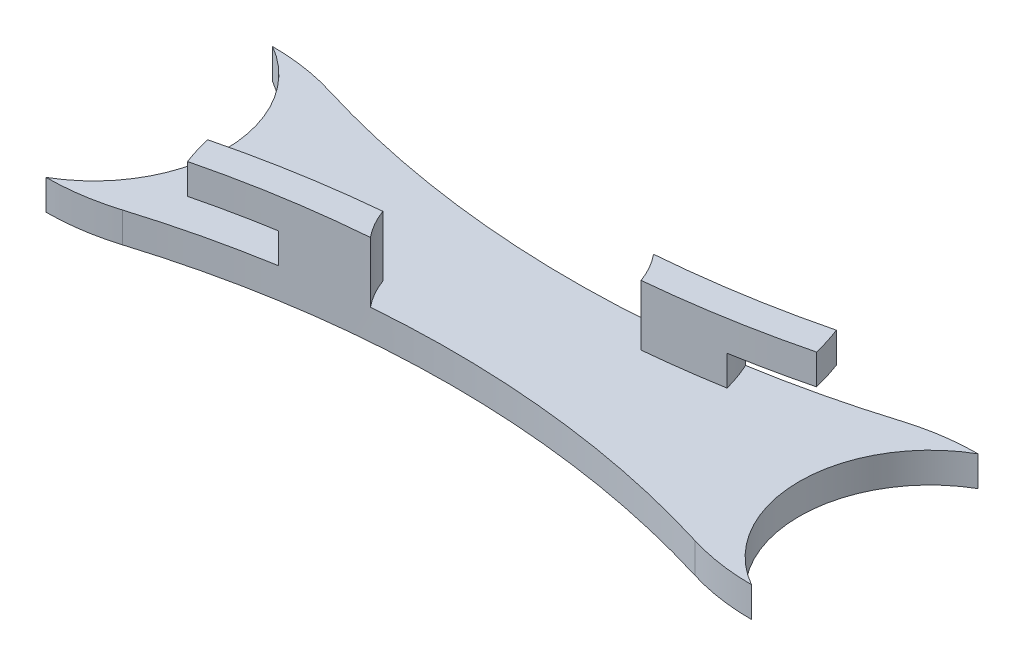
ISO-10303-21;
HEADER;
FILE_DESCRIPTION(('STEP AP214'),'2;1');
FILE_NAME('part.step','',(''),(''),'','','');
FILE_SCHEMA(('AUTOMOTIVE_DESIGN { 1 0 10303 214 1 1 1 1 }'));
ENDSEC;
DATA;
#1=APPLICATION_CONTEXT('core data for automotive mechanical design processes');
#2=APPLICATION_PROTOCOL_DEFINITION('international standard','automotive_design',2000,#1);
#3=PRODUCT_CONTEXT('',#1,'mechanical');
#4=PRODUCT('Part','Part','',(#3));
#5=PRODUCT_RELATED_PRODUCT_CATEGORY('part','',(#4));
#6=PRODUCT_DEFINITION_FORMATION('','',#4);
#7=PRODUCT_DEFINITION_CONTEXT('part definition',#1,'design');
#8=PRODUCT_DEFINITION('design','',#6,#7);
#9=PRODUCT_DEFINITION_SHAPE('','',#8);
#10=(LENGTH_UNIT() NAMED_UNIT(*) SI_UNIT(.MILLI.,.METRE.));
#11=(NAMED_UNIT(*) PLANE_ANGLE_UNIT() SI_UNIT($,.RADIAN.));
#12=(NAMED_UNIT(*) SI_UNIT($,.STERADIAN.) SOLID_ANGLE_UNIT());
#13=UNCERTAINTY_MEASURE_WITH_UNIT(LENGTH_MEASURE(1.E-05),#10,'distance_accuracy_value','');
#14=(GEOMETRIC_REPRESENTATION_CONTEXT(3) GLOBAL_UNCERTAINTY_ASSIGNED_CONTEXT((#13)) GLOBAL_UNIT_ASSIGNED_CONTEXT((#10,
#11,#12)) REPRESENTATION_CONTEXT('',''));
#15=CARTESIAN_POINT('',(0.,0.,0.));
#16=DIRECTION('',(0.,0.,1.));
#17=DIRECTION('',(1.,0.,0.));
#18=AXIS2_PLACEMENT_3D('',#15,#16,#17);
#19=CARTESIAN_POINT('',(0.,3.,0.));
#20=DIRECTION('',(0.,1.,0.));
#21=DIRECTION('',(0.,0.,1.));
#22=AXIS2_PLACEMENT_3D('',#19,#20,#21);
#23=PLANE('',#22);
#24=CARTESIAN_POINT('',(-18.3907804623369,3.,22.3216384207448));
#25=DIRECTION('',(0.,1.,0.));
#26=DIRECTION('',(0.,0.,1.));
#27=AXIS2_PLACEMENT_3D('',#24,#25,#26);
#28=CIRCLE('',#27,99.9074307873152);
#29=CARTESIAN_POINT('',(-27.7796908463692,3.,-77.143647424734));
#30=VERTEX_POINT('',#29);
#31=CARTESIAN_POINT('',(-35.3170488189357,3.,-76.141533202165));
#32=VERTEX_POINT('',#31);
#33=EDGE_CURVE('E63',#30,#32,#28,.T.);
#34=ORIENTED_EDGE('',*,*,#33,.F.);
#35=CARTESIAN_POINT('',(-18.3907804623369,3.,-80.5857923665705));
#36=DIRECTION('',(0.,1.,0.));
#37=DIRECTION('',(0.,0.,1.));
#38=AXIS2_PLACEMENT_3D('',#35,#36,#37);
#39=CIRCLE('',#38,10.);
#40=CARTESIAN_POINT('',(-26.1478285794307,3.,-74.2748332865976));
#41=VERTEX_POINT('',#40);
#42=EDGE_CURVE('E273',#30,#41,#39,.T.);
#43=ORIENTED_EDGE('',*,*,#42,.T.);
#44=CARTESIAN_POINT('',(-18.3907804623369,3.,22.3216384207448));
#45=DIRECTION('',(0.,1.,0.));
#46=DIRECTION('',(0.,0.,1.));
#47=AXIS2_PLACEMENT_3D('',#44,#45,#46);
#48=CIRCLE('',#47,96.9074307873152);
#49=CARTESIAN_POINT('',(10.0483327179945,3.,-70.3188871785554));
#50=VERTEX_POINT('',#49);
#51=EDGE_CURVE('E192',#50,#41,#48,.T.);
#52=ORIENTED_EDGE('',*,*,#51,.F.);
#53=CARTESIAN_POINT('',(16.6562249214557,3.,-91.8441226157684));
#54=DIRECTION('',(0.,1.,0.));
#55=DIRECTION('',(0.,0.,1.));
#56=AXIS2_PLACEMENT_3D('',#53,#54,#55);
#57=CIRCLE('',#56,22.5166604983957);
#58=CARTESIAN_POINT('',(16.6562249214557,3.,-69.3274621173727));
#59=VERTEX_POINT('',#58);
#60=EDGE_CURVE('E330',#50,#59,#57,.T.);
#61=ORIENTED_EDGE('',*,*,#60,.T.);
#62=CARTESIAN_POINT('',(23.1562249214557,3.,-80.5857923665705));
#63=DIRECTION('',(0.,1.,0.));
#64=DIRECTION('',(0.,0.,1.));
#65=AXIS2_PLACEMENT_3D('',#62,#63,#64);
#66=CIRCLE('',#65,13.0000000000002);
#67=CARTESIAN_POINT('',(16.6562249214557,3.,-91.8441226157684));
#68=VERTEX_POINT('',#67);
#69=EDGE_CURVE('E333',#68,#59,#66,.T.);
#70=ORIENTED_EDGE('',*,*,#69,.F.);
#71=CARTESIAN_POINT('',(16.6562249214557,3.,-69.3274621173726));
#72=DIRECTION('',(0.,1.,0.));
#73=DIRECTION('',(0.,0.,1.));
#74=AXIS2_PLACEMENT_3D('',#71,#72,#73);
#75=CIRCLE('',#74,22.5166604983957);
#76=CARTESIAN_POINT('',(10.0483327179944,3.,-90.8526975545857));
#77=VERTEX_POINT('',#76);
#78=EDGE_CURVE('E337',#68,#77,#75,.T.);
#79=ORIENTED_EDGE('',*,*,#78,.T.);
#80=CARTESIAN_POINT('',(-18.3907804623369,3.,-183.493223153886));
#81=DIRECTION('',(0.,1.,0.));
#82=DIRECTION('',(0.,0.,1.));
#83=AXIS2_PLACEMENT_3D('',#80,#81,#82);
#84=CIRCLE('',#83,96.9074307873153);
#85=CARTESIAN_POINT('',(-2.49207111624066,3.,-87.8988656691125));
#86=VERTEX_POINT('',#85);
#87=EDGE_CURVE('E341',#86,#77,#84,.T.);
#88=ORIENTED_EDGE('',*,*,#87,.F.);
#89=CARTESIAN_POINT('',(-18.3907804623369,3.,-80.5857923665705));
#90=DIRECTION('',(0.,1.,0.));
#91=DIRECTION('',(0.,0.,1.));
#92=AXIS2_PLACEMENT_3D('',#89,#90,#91);
#93=CIRCLE('',#92,17.5);
#94=CARTESIAN_POINT('',(-1.46451210573816,3.,-85.0300515309761));
#95=VERTEX_POINT('',#94);
#96=EDGE_CURVE('E297',#95,#86,#93,.T.);
#97=ORIENTED_EDGE('',*,*,#96,.F.);
#98=CARTESIAN_POINT('',(-18.3907804623369,3.,-183.493223153886));
#99=DIRECTION('',(0.,1.,0.));
#100=DIRECTION('',(0.,0.,1.));
#101=AXIS2_PLACEMENT_3D('',#98,#99,#100);
#102=CIRCLE('',#101,99.9074307873152);
#103=CARTESIAN_POINT('',(-9.00187007830468,3.,-84.0279373084071));
#104=VERTEX_POINT('',#103);
#105=EDGE_CURVE('E70',#104,#95,#102,.T.);
#106=ORIENTED_EDGE('',*,*,#105,.F.);
#107=CARTESIAN_POINT('',(-18.3907804623369,3.,-80.5857923665705));
#108=DIRECTION('',(0.,1.,0.));
#109=DIRECTION('',(0.,0.,1.));
#110=AXIS2_PLACEMENT_3D('',#107,#108,#109);
#111=CIRCLE('',#110,10.);
#112=CARTESIAN_POINT('',(-10.6337323452432,3.,-86.8967514465435));
#113=VERTEX_POINT('',#112);
#114=EDGE_CURVE('E237',#104,#113,#111,.T.);
#115=ORIENTED_EDGE('',*,*,#114,.T.);
#116=CARTESIAN_POINT('',(-46.8298936426683,3.,-90.8526975545857));
#117=VERTEX_POINT('',#116);
#118=EDGE_CURVE('E342',#117,#113,#84,.T.);
#119=ORIENTED_EDGE('',*,*,#118,.F.);
#120=CARTESIAN_POINT('',(-53.4377858461296,3.,-69.3274621173728));
#121=DIRECTION('',(0.,1.,0.));
#122=DIRECTION('',(0.,0.,1.));
#123=AXIS2_PLACEMENT_3D('',#120,#121,#122);
#124=CIRCLE('',#123,22.5166604983956);
#125=CARTESIAN_POINT('',(-53.4377858461296,3.,-91.8441226157684));
#126=VERTEX_POINT('',#125);
#127=EDGE_CURVE('E346',#117,#126,#124,.T.);
#128=ORIENTED_EDGE('',*,*,#127,.T.);
#129=CARTESIAN_POINT('',(-59.9377858461296,3.,-80.5857923665705));
#130=DIRECTION('',(0.,1.,0.));
#131=DIRECTION('',(0.,0.,1.));
#132=AXIS2_PLACEMENT_3D('',#129,#130,#131);
#133=CIRCLE('',#132,13.0000000000001);
#134=CARTESIAN_POINT('',(-53.4377858461296,3.,-69.3274621173728));
#135=VERTEX_POINT('',#134);
#136=EDGE_CURVE('E318',#135,#126,#133,.T.);
#137=ORIENTED_EDGE('',*,*,#136,.F.);
#138=CARTESIAN_POINT('',(-53.4377858461296,3.,-91.8441226157683));
#139=DIRECTION('',(0.,1.,0.));
#140=DIRECTION('',(0.,0.,1.));
#141=AXIS2_PLACEMENT_3D('',#138,#139,#140);
#142=CIRCLE('',#141,22.5166604983955);
#143=CARTESIAN_POINT('',(-46.8298936426682,3.,-70.3188871785554));
#144=VERTEX_POINT('',#143);
#145=EDGE_CURVE('E322',#135,#144,#142,.T.);
#146=ORIENTED_EDGE('',*,*,#145,.T.);
#147=CARTESIAN_POINT('',(-34.2894898084332,3.,-73.2727190640286));
#148=VERTEX_POINT('',#147);
#149=EDGE_CURVE('E327',#148,#144,#48,.T.);
#150=ORIENTED_EDGE('',*,*,#149,.F.);
#151=CARTESIAN_POINT('',(-18.3907804623369,3.,-80.5857923665705));
#152=DIRECTION('',(0.,1.,0.));
#153=DIRECTION('',(0.,0.,1.));
#154=AXIS2_PLACEMENT_3D('',#151,#152,#153);
#155=CIRCLE('',#154,17.5);
#156=EDGE_CURVE('E272',#32,#148,#155,.T.);
#157=ORIENTED_EDGE('',*,*,#156,.F.);
#158=EDGE_LOOP('',(#34,#43,#52,#61,#70,#79,#88,#97,#106,#115,#119,#128,#137,#146,#150,#157));
#159=FACE_BOUND('',#158,.T.);
#160=ADVANCED_FACE('F47',(#159),#23,.T.);
#161=CARTESIAN_POINT('',(-59.9377858461296,3.,-80.5857923665705));
#162=DIRECTION('',(0.,-1.,0.));
#163=DIRECTION('',(0.,0.,-1.));
#164=AXIS2_PLACEMENT_3D('',#161,#162,#163);
#165=CYLINDRICAL_SURFACE('',#164,13.0000000000001);
#166=CARTESIAN_POINT('',(-59.9377858461296,0.,-80.5857923665705));
#167=DIRECTION('',(0.,1.,0.));
#168=DIRECTION('',(0.,0.,1.));
#169=AXIS2_PLACEMENT_3D('',#166,#167,#168);
#170=CIRCLE('',#169,13.0000000000001);
#171=CARTESIAN_POINT('',(-53.4377858461296,0.,-69.3274621173728));
#172=VERTEX_POINT('',#171);
#173=CARTESIAN_POINT('',(-53.4377858461296,0.,-91.8441226157684));
#174=VERTEX_POINT('',#173);
#175=EDGE_CURVE('E291',#172,#174,#170,.T.);
#176=ORIENTED_EDGE('',*,*,#175,.F.);
#177=DIRECTION('',(0.,-1.,0.));
#178=VECTOR('',#177,1.);
#179=CARTESIAN_POINT('',(-53.4377858461296,3.,-69.3274621173728));
#180=LINE('',#179,#178);
#181=EDGE_CURVE('E11',#135,#172,#180,.T.);
#182=ORIENTED_EDGE('',*,*,#181,.F.);
#183=ORIENTED_EDGE('',*,*,#136,.T.);
#184=DIRECTION('',(0.,-1.,0.));
#185=VECTOR('',#184,1.);
#186=CARTESIAN_POINT('',(-53.4377858461296,3.,-91.8441226157684));
#187=LINE('',#186,#185);
#188=EDGE_CURVE('E349',#126,#174,#187,.T.);
#189=ORIENTED_EDGE('',*,*,#188,.T.);
#190=EDGE_LOOP('',(#176,#182,#183,#189));
#191=FACE_BOUND('',#190,.T.);
#192=ADVANCED_FACE('F49',(#191),#165,.F.);
#193=CARTESIAN_POINT('',(-53.4377858461296,3.,-91.8441226157683));
#194=DIRECTION('',(0.,-1.,0.));
#195=DIRECTION('',(0.,0.,-1.));
#196=AXIS2_PLACEMENT_3D('',#193,#194,#195);
#197=CYLINDRICAL_SURFACE('',#196,22.5166604983955);
#198=CARTESIAN_POINT('',(-53.4377858461296,0.,-91.8441226157683));
#199=DIRECTION('',(0.,1.,0.));
#200=DIRECTION('',(0.,0.,1.));
#201=AXIS2_PLACEMENT_3D('',#198,#199,#200);
#202=CIRCLE('',#201,22.5166604983955);
#203=CARTESIAN_POINT('',(-46.8298936426682,0.,-70.3188871785554));
#204=VERTEX_POINT('',#203);
#205=EDGE_CURVE('E353',#172,#204,#202,.T.);
#206=ORIENTED_EDGE('',*,*,#205,.T.);
#207=DIRECTION('',(0.,-1.,0.));
#208=VECTOR('',#207,1.);
#209=CARTESIAN_POINT('',(-46.8298936426682,3.,-70.3188871785554));
#210=LINE('',#209,#208);
#211=EDGE_CURVE('E56',#144,#204,#210,.T.);
#212=ORIENTED_EDGE('',*,*,#211,.F.);
#213=ORIENTED_EDGE('',*,*,#145,.F.);
#214=ORIENTED_EDGE('',*,*,#181,.T.);
#215=EDGE_LOOP('',(#206,#212,#213,#214));
#216=FACE_BOUND('',#215,.T.);
#217=ADVANCED_FACE('F401',(#216),#197,.T.);
#218=CARTESIAN_POINT('',(-18.3907804623369,3.,22.3216384207448));
#219=DIRECTION('',(0.,-1.,0.));
#220=DIRECTION('',(0.,0.,-1.));
#221=AXIS2_PLACEMENT_3D('',#218,#219,#220);
#222=CYLINDRICAL_SURFACE('',#221,96.9074307873152);
#223=CARTESIAN_POINT('',(-18.3907804623369,0.,22.3216384207448));
#224=DIRECTION('',(0.,1.,0.));
#225=DIRECTION('',(0.,0.,1.));
#226=AXIS2_PLACEMENT_3D('',#223,#224,#225);
#227=CIRCLE('',#226,96.9074307873152);
#228=CARTESIAN_POINT('',(10.0483327179945,0.,-70.3188871785554));
#229=VERTEX_POINT('',#228);
#230=EDGE_CURVE('E357',#229,#204,#227,.T.);
#231=ORIENTED_EDGE('',*,*,#230,.F.);
#232=DIRECTION('',(0.,-1.,0.));
#233=VECTOR('',#232,1.);
#234=CARTESIAN_POINT('',(10.0483327179945,3.,-70.3188871785554));
#235=LINE('',#234,#233);
#236=EDGE_CURVE('E394',#50,#229,#235,.T.);
#237=ORIENTED_EDGE('',*,*,#236,.F.);
#238=ORIENTED_EDGE('',*,*,#51,.T.);
#239=DIRECTION('',(0.,-1.,0.));
#240=VECTOR('',#239,1.);
#241=CARTESIAN_POINT('',(-26.1478285794307,6.,-74.2748332865976));
#242=LINE('',#241,#240);
#243=CARTESIAN_POINT('',(-26.1478285794307,9.,-74.2748332865975));
#244=VERTEX_POINT('',#243);
#245=EDGE_CURVE('E184',#244,#41,#242,.T.);
#246=ORIENTED_EDGE('',*,*,#245,.F.);
#247=CARTESIAN_POINT('',(-18.3907804623369,9.,22.3216384207448));
#248=DIRECTION('',(0.,1.,0.));
#249=DIRECTION('',(0.,0.,1.));
#250=AXIS2_PLACEMENT_3D('',#247,#248,#249);
#251=CIRCLE('',#250,96.9074307873152);
#252=CARTESIAN_POINT('',(-41.7674479828455,9.,-71.7239970836947));
#253=VERTEX_POINT('',#252);
#254=EDGE_CURVE('E190',#244,#253,#251,.T.);
#255=ORIENTED_EDGE('',*,*,#254,.T.);
#256=DIRECTION('',(0.,-1.,0.));
#257=VECTOR('',#256,1.);
#258=CARTESIAN_POINT('',(-41.7674479828455,9.,-71.7239970836947));
#259=LINE('',#258,#257);
#260=CARTESIAN_POINT('',(-41.7674479828455,6.,-71.7239970836947));
#261=VERTEX_POINT('',#260);
#262=EDGE_CURVE('E224',#253,#261,#259,.T.);
#263=ORIENTED_EDGE('',*,*,#262,.T.);
#264=CARTESIAN_POINT('',(-18.3907804623369,6.,22.3216384207448));
#265=DIRECTION('',(0.,1.,0.));
#266=DIRECTION('',(0.,0.,1.));
#267=AXIS2_PLACEMENT_3D('',#264,#265,#266);
#268=CIRCLE('',#267,96.9074307873152);
#269=CARTESIAN_POINT('',(-34.2894898084332,6.,-73.2727190640285));
#270=VERTEX_POINT('',#269);
#271=EDGE_CURVE('E225',#270,#261,#268,.T.);
#272=ORIENTED_EDGE('',*,*,#271,.F.);
#273=DIRECTION('',(0.,-1.,0.));
#274=VECTOR('',#273,1.);
#275=CARTESIAN_POINT('',(-34.2894898084332,6.,-73.2727190640286));
#276=LINE('',#275,#274);
#277=EDGE_CURVE('E196',#270,#148,#276,.T.);
#278=ORIENTED_EDGE('',*,*,#277,.T.);
#279=ORIENTED_EDGE('',*,*,#149,.T.);
#280=ORIENTED_EDGE('',*,*,#211,.T.);
#281=EDGE_LOOP('',(#231,#237,#238,#246,#255,#263,#272,#278,#279,#280));
#282=FACE_BOUND('',#281,.T.);
#283=ADVANCED_FACE('F187',(#282),#222,.F.);
#284=CARTESIAN_POINT('',(16.6562249214557,3.,-91.8441226157684));
#285=DIRECTION('',(0.,-1.,0.));
#286=DIRECTION('',(0.,0.,-1.));
#287=AXIS2_PLACEMENT_3D('',#284,#285,#286);
#288=CYLINDRICAL_SURFACE('',#287,22.5166604983957);
#289=CARTESIAN_POINT('',(16.6562249214557,0.,-91.8441226157684));
#290=DIRECTION('',(0.,1.,0.));
#291=DIRECTION('',(0.,0.,1.));
#292=AXIS2_PLACEMENT_3D('',#289,#290,#291);
#293=CIRCLE('',#292,22.5166604983957);
#294=CARTESIAN_POINT('',(16.6562249214557,0.,-69.3274621173727));
#295=VERTEX_POINT('',#294);
#296=EDGE_CURVE('E361',#229,#295,#293,.T.);
#297=ORIENTED_EDGE('',*,*,#296,.T.);
#298=DIRECTION('',(0.,-1.,0.));
#299=VECTOR('',#298,1.);
#300=CARTESIAN_POINT('',(16.6562249214557,3.,-69.3274621173727));
#301=LINE('',#300,#299);
#302=EDGE_CURVE('E391',#59,#295,#301,.T.);
#303=ORIENTED_EDGE('',*,*,#302,.F.);
#304=ORIENTED_EDGE('',*,*,#60,.F.);
#305=ORIENTED_EDGE('',*,*,#236,.T.);
#306=EDGE_LOOP('',(#297,#303,#304,#305));
#307=FACE_BOUND('',#306,.T.);
#308=ADVANCED_FACE('F410',(#307),#288,.T.);
#309=CARTESIAN_POINT('',(23.1562249214557,3.,-80.5857923665705));
#310=DIRECTION('',(0.,-1.,0.));
#311=DIRECTION('',(0.,0.,-1.));
#312=AXIS2_PLACEMENT_3D('',#309,#310,#311);
#313=CYLINDRICAL_SURFACE('',#312,13.0000000000002);
#314=CARTESIAN_POINT('',(23.1562249214557,0.,-80.5857923665705));
#315=DIRECTION('',(0.,1.,0.));
#316=DIRECTION('',(0.,0.,1.));
#317=AXIS2_PLACEMENT_3D('',#314,#315,#316);
#318=CIRCLE('',#317,13.0000000000002);
#319=CARTESIAN_POINT('',(16.6562249214557,0.,-91.8441226157684));
#320=VERTEX_POINT('',#319);
#321=EDGE_CURVE('E365',#320,#295,#318,.T.);
#322=ORIENTED_EDGE('',*,*,#321,.F.);
#323=DIRECTION('',(0.,-1.,0.));
#324=VECTOR('',#323,1.);
#325=CARTESIAN_POINT('',(16.6562249214557,3.,-91.8441226157684));
#326=LINE('',#325,#324);
#327=EDGE_CURVE('E388',#68,#320,#326,.T.);
#328=ORIENTED_EDGE('',*,*,#327,.F.);
#329=ORIENTED_EDGE('',*,*,#69,.T.);
#330=ORIENTED_EDGE('',*,*,#302,.T.);
#331=EDGE_LOOP('',(#322,#328,#329,#330));
#332=FACE_BOUND('',#331,.T.);
#333=ADVANCED_FACE('F437',(#332),#313,.F.);
#334=CARTESIAN_POINT('',(16.6562249214557,3.,-69.3274621173726));
#335=DIRECTION('',(0.,-1.,0.));
#336=DIRECTION('',(0.,0.,-1.));
#337=AXIS2_PLACEMENT_3D('',#334,#335,#336);
#338=CYLINDRICAL_SURFACE('',#337,22.5166604983957);
#339=CARTESIAN_POINT('',(16.6562249214557,0.,-69.3274621173726));
#340=DIRECTION('',(0.,1.,0.));
#341=DIRECTION('',(0.,0.,1.));
#342=AXIS2_PLACEMENT_3D('',#339,#340,#341);
#343=CIRCLE('',#342,22.5166604983957);
#344=CARTESIAN_POINT('',(10.0483327179944,0.,-90.8526975545857));
#345=VERTEX_POINT('',#344);
#346=EDGE_CURVE('E369',#320,#345,#343,.T.);
#347=ORIENTED_EDGE('',*,*,#346,.T.);
#348=DIRECTION('',(0.,-1.,0.));
#349=VECTOR('',#348,1.);
#350=CARTESIAN_POINT('',(10.0483327179944,3.,-90.8526975545857));
#351=LINE('',#350,#349);
#352=EDGE_CURVE('E385',#77,#345,#351,.T.);
#353=ORIENTED_EDGE('',*,*,#352,.F.);
#354=ORIENTED_EDGE('',*,*,#78,.F.);
#355=ORIENTED_EDGE('',*,*,#327,.T.);
#356=EDGE_LOOP('',(#347,#353,#354,#355));
#357=FACE_BOUND('',#356,.T.);
#358=ADVANCED_FACE('F433',(#357),#338,.T.);
#359=CARTESIAN_POINT('',(-18.3907804623369,3.,-183.493223153886));
#360=DIRECTION('',(0.,-1.,0.));
#361=DIRECTION('',(0.,0.,-1.));
#362=AXIS2_PLACEMENT_3D('',#359,#360,#361);
#363=CYLINDRICAL_SURFACE('',#362,96.9074307873153);
#364=CARTESIAN_POINT('',(-18.3907804623369,0.,-183.493223153886));
#365=DIRECTION('',(0.,1.,0.));
#366=DIRECTION('',(0.,0.,1.));
#367=AXIS2_PLACEMENT_3D('',#364,#365,#366);
#368=CIRCLE('',#367,96.9074307873153);
#369=CARTESIAN_POINT('',(-46.8298936426683,0.,-90.8526975545857));
#370=VERTEX_POINT('',#369);
#371=EDGE_CURVE('E373',#370,#345,#368,.T.);
#372=ORIENTED_EDGE('',*,*,#371,.F.);
#373=DIRECTION('',(0.,-1.,0.));
#374=VECTOR('',#373,1.);
#375=CARTESIAN_POINT('',(-46.8298936426683,3.,-90.8526975545857));
#376=LINE('',#375,#374);
#377=EDGE_CURVE('E382',#117,#370,#376,.T.);
#378=ORIENTED_EDGE('',*,*,#377,.F.);
#379=ORIENTED_EDGE('',*,*,#118,.T.);
#380=DIRECTION('',(0.,-1.,0.));
#381=VECTOR('',#380,1.);
#382=CARTESIAN_POINT('',(-10.6337323452432,6.,-86.8967514465435));
#383=LINE('',#382,#381);
#384=CARTESIAN_POINT('',(-10.6337323452432,9.,-86.8967514465435));
#385=VERTEX_POINT('',#384);
#386=EDGE_CURVE('E296',#385,#113,#383,.T.);
#387=ORIENTED_EDGE('',*,*,#386,.F.);
#388=CARTESIAN_POINT('',(-18.3907804623369,9.,-183.493223153886));
#389=DIRECTION('',(0.,1.,0.));
#390=DIRECTION('',(0.,0.,1.));
#391=AXIS2_PLACEMENT_3D('',#388,#389,#390);
#392=CIRCLE('',#391,96.9074307873153);
#393=CARTESIAN_POINT('',(4.98588705817165,9.,-89.4475876494463));
#394=VERTEX_POINT('',#393);
#395=EDGE_CURVE('E238',#385,#394,#392,.T.);
#396=ORIENTED_EDGE('',*,*,#395,.T.);
#397=DIRECTION('',(0.,-1.,0.));
#398=VECTOR('',#397,1.);
#399=CARTESIAN_POINT('',(4.98588705817165,9.,-89.4475876494463));
#400=LINE('',#399,#398);
#401=CARTESIAN_POINT('',(4.98588705817165,6.,-89.4475876494463));
#402=VERTEX_POINT('',#401);
#403=EDGE_CURVE('E253',#394,#402,#400,.T.);
#404=ORIENTED_EDGE('',*,*,#403,.T.);
#405=CARTESIAN_POINT('',(-18.3907804623369,6.,-183.493223153886));
#406=DIRECTION('',(0.,1.,0.));
#407=DIRECTION('',(0.,0.,1.));
#408=AXIS2_PLACEMENT_3D('',#405,#406,#407);
#409=CIRCLE('',#408,96.9074307873153);
#410=CARTESIAN_POINT('',(-2.49207111624066,6.,-87.8988656691124));
#411=VERTEX_POINT('',#410);
#412=EDGE_CURVE('E254',#411,#402,#409,.T.);
#413=ORIENTED_EDGE('',*,*,#412,.F.);
#414=DIRECTION('',(0.,-1.,0.));
#415=VECTOR('',#414,1.);
#416=CARTESIAN_POINT('',(-2.49207111624066,6.,-87.8988656691125));
#417=LINE('',#416,#415);
#418=EDGE_CURVE('E308',#411,#86,#417,.T.);
#419=ORIENTED_EDGE('',*,*,#418,.T.);
#420=ORIENTED_EDGE('',*,*,#87,.T.);
#421=ORIENTED_EDGE('',*,*,#352,.T.);
#422=EDGE_LOOP('',(#372,#378,#379,#387,#396,#404,#413,#419,#420,#421));
#423=FACE_BOUND('',#422,.T.);
#424=ADVANCED_FACE('F429',(#423),#363,.F.);
#425=CARTESIAN_POINT('',(-53.4377858461296,3.,-69.3274621173728));
#426=DIRECTION('',(0.,-1.,0.));
#427=DIRECTION('',(0.,0.,-1.));
#428=AXIS2_PLACEMENT_3D('',#425,#426,#427);
#429=CYLINDRICAL_SURFACE('',#428,22.5166604983956);
#430=CARTESIAN_POINT('',(-53.4377858461296,0.,-69.3274621173728));
#431=DIRECTION('',(0.,1.,0.));
#432=DIRECTION('',(0.,0.,1.));
#433=AXIS2_PLACEMENT_3D('',#430,#431,#432);
#434=CIRCLE('',#433,22.5166604983956);
#435=EDGE_CURVE('E323',#370,#174,#434,.T.);
#436=ORIENTED_EDGE('',*,*,#435,.T.);
#437=ORIENTED_EDGE('',*,*,#188,.F.);
#438=ORIENTED_EDGE('',*,*,#127,.F.);
#439=ORIENTED_EDGE('',*,*,#377,.T.);
#440=EDGE_LOOP('',(#436,#437,#438,#439));
#441=FACE_BOUND('',#440,.T.);
#442=ADVANCED_FACE('F426',(#441),#429,.T.);
#443=CARTESIAN_POINT('',(0.,0.,0.));
#444=DIRECTION('',(0.,1.,0.));
#445=DIRECTION('',(0.,0.,1.));
#446=AXIS2_PLACEMENT_3D('',#443,#444,#445);
#447=PLANE('',#446);
#448=ORIENTED_EDGE('',*,*,#175,.T.);
#449=ORIENTED_EDGE('',*,*,#435,.F.);
#450=ORIENTED_EDGE('',*,*,#371,.T.);
#451=ORIENTED_EDGE('',*,*,#346,.F.);
#452=ORIENTED_EDGE('',*,*,#321,.T.);
#453=ORIENTED_EDGE('',*,*,#296,.F.);
#454=ORIENTED_EDGE('',*,*,#230,.T.);
#455=ORIENTED_EDGE('',*,*,#205,.F.);
#456=EDGE_LOOP('',(#448,#449,#450,#451,#452,#453,#454,#455));
#457=FACE_BOUND('',#456,.T.);
#458=ADVANCED_FACE('F405',(#457),#447,.F.);
#459=CARTESIAN_POINT('',(-18.3907804623369,6.,-80.5857923665705));
#460=DIRECTION('',(0.,-1.,0.));
#461=DIRECTION('',(0.,0.,-1.));
#462=AXIS2_PLACEMENT_3D('',#459,#460,#461);
#463=CYLINDRICAL_SURFACE('',#462,10.);
#464=ORIENTED_EDGE('',*,*,#114,.F.);
#465=DIRECTION('',(0.,-1.,0.));
#466=VECTOR('',#465,1.);
#467=CARTESIAN_POINT('',(-9.00187007830468,6.,-84.0279373084071));
#468=LINE('',#467,#466);
#469=CARTESIAN_POINT('',(-9.00187007830468,9.,-84.0279373084071));
#470=VERTEX_POINT('',#469);
#471=EDGE_CURVE('E276',#470,#104,#468,.T.);
#472=ORIENTED_EDGE('',*,*,#471,.F.);
#473=CARTESIAN_POINT('',(-18.3907804623369,9.,-80.5857923665705));
#474=DIRECTION('',(0.,1.,0.));
#475=DIRECTION('',(0.,0.,1.));
#476=AXIS2_PLACEMENT_3D('',#473,#474,#475);
#477=CIRCLE('',#476,10.);
#478=EDGE_CURVE('E242',#470,#385,#477,.T.);
#479=ORIENTED_EDGE('',*,*,#478,.T.);
#480=ORIENTED_EDGE('',*,*,#386,.T.);
#481=EDGE_LOOP('',(#464,#472,#479,#480));
#482=FACE_BOUND('',#481,.T.);
#483=ADVANCED_FACE('F423',(#482),#463,.F.);
#484=CARTESIAN_POINT('',(-18.3907804623369,6.,-183.493223153886));
#485=DIRECTION('',(0.,-1.,0.));
#486=DIRECTION('',(0.,0.,-1.));
#487=AXIS2_PLACEMENT_3D('',#484,#485,#486);
#488=CYLINDRICAL_SURFACE('',#487,99.9074307873152);
#489=ORIENTED_EDGE('',*,*,#105,.T.);
#490=DIRECTION('',(0.,-1.,0.));
#491=VECTOR('',#490,1.);
#492=CARTESIAN_POINT('',(-1.46451210573816,6.,-85.0300515309761));
#493=LINE('',#492,#491);
#494=CARTESIAN_POINT('',(-1.46451210573816,6.,-85.0300515309761));
#495=VERTEX_POINT('',#494);
#496=EDGE_CURVE('E312',#495,#95,#493,.T.);
#497=ORIENTED_EDGE('',*,*,#496,.F.);
#498=CARTESIAN_POINT('',(-18.3907804623369,6.,-183.493223153886));
#499=DIRECTION('',(0.,1.,0.));
#500=DIRECTION('',(0.,0.,1.));
#501=AXIS2_PLACEMENT_3D('',#498,#499,#500);
#502=CIRCLE('',#501,99.9074307873152);
#503=CARTESIAN_POINT('',(5.8802759011343,6.,-86.5787735113099));
#504=VERTEX_POINT('',#503);
#505=EDGE_CURVE('E257',#495,#504,#502,.T.);
#506=ORIENTED_EDGE('',*,*,#505,.T.);
#507=DIRECTION('',(0.,-1.,0.));
#508=VECTOR('',#507,1.);
#509=CARTESIAN_POINT('',(5.8802759011343,9.,-86.5787735113099));
#510=LINE('',#509,#508);
#511=CARTESIAN_POINT('',(5.8802759011343,9.,-86.5787735113099));
#512=VERTEX_POINT('',#511);
#513=EDGE_CURVE('E228',#512,#504,#510,.T.);
#514=ORIENTED_EDGE('',*,*,#513,.F.);
#515=CARTESIAN_POINT('',(-18.3907804623369,9.,-183.493223153886));
#516=DIRECTION('',(0.,1.,0.));
#517=DIRECTION('',(0.,0.,1.));
#518=AXIS2_PLACEMENT_3D('',#515,#516,#517);
#519=CIRCLE('',#518,99.9074307873152);
#520=EDGE_CURVE('E247',#470,#512,#519,.T.);
#521=ORIENTED_EDGE('',*,*,#520,.F.);
#522=ORIENTED_EDGE('',*,*,#471,.T.);
#523=EDGE_LOOP('',(#489,#497,#506,#514,#521,#522));
#524=FACE_BOUND('',#523,.T.);
#525=ADVANCED_FACE('F517',(#524),#488,.T.);
#526=CARTESIAN_POINT('',(-18.3907804623369,6.,-80.5857923665705));
#527=DIRECTION('',(0.,-1.,0.));
#528=DIRECTION('',(0.,0.,-1.));
#529=AXIS2_PLACEMENT_3D('',#526,#527,#528);
#530=CYLINDRICAL_SURFACE('',#529,17.5);
#531=ORIENTED_EDGE('',*,*,#96,.T.);
#532=ORIENTED_EDGE('',*,*,#418,.F.);
#533=CARTESIAN_POINT('',(-18.3907804623369,6.,-80.5857923665705));
#534=DIRECTION('',(0.,1.,0.));
#535=DIRECTION('',(0.,0.,1.));
#536=AXIS2_PLACEMENT_3D('',#533,#534,#535);
#537=CIRCLE('',#536,17.5);
#538=EDGE_CURVE('E292',#495,#411,#537,.T.);
#539=ORIENTED_EDGE('',*,*,#538,.F.);
#540=ORIENTED_EDGE('',*,*,#496,.T.);
#541=EDGE_LOOP('',(#531,#532,#539,#540));
#542=FACE_BOUND('',#541,.T.);
#543=ADVANCED_FACE('F528',(#542),#530,.T.);
#544=CARTESIAN_POINT('',(-18.3907804623369,6.,-80.5857923665705));
#545=DIRECTION('',(0.,-1.,0.));
#546=DIRECTION('',(0.,0.,-1.));
#547=AXIS2_PLACEMENT_3D('',#544,#545,#546);
#548=CYLINDRICAL_SURFACE('',#547,10.);
#549=ORIENTED_EDGE('',*,*,#42,.F.);
#550=DIRECTION('',(0.,-1.,0.));
#551=VECTOR('',#550,1.);
#552=CARTESIAN_POINT('',(-27.7796908463692,6.,-77.143647424734));
#553=LINE('',#552,#551);
#554=CARTESIAN_POINT('',(-27.7796908463692,9.,-77.143647424734));
#555=VERTEX_POINT('',#554);
#556=EDGE_CURVE('E202',#555,#30,#553,.T.);
#557=ORIENTED_EDGE('',*,*,#556,.F.);
#558=CARTESIAN_POINT('',(-18.3907804623369,9.,-80.5857923665705));
#559=DIRECTION('',(0.,1.,0.));
#560=DIRECTION('',(0.,0.,1.));
#561=AXIS2_PLACEMENT_3D('',#558,#559,#560);
#562=CIRCLE('',#561,10.);
#563=EDGE_CURVE('E200',#244,#555,#562,.F.);
#564=ORIENTED_EDGE('',*,*,#563,.F.);
#565=ORIENTED_EDGE('',*,*,#245,.T.);
#566=EDGE_LOOP('',(#549,#557,#564,#565));
#567=FACE_BOUND('',#566,.T.);
#568=ADVANCED_FACE('F201',(#567),#548,.F.);
#569=CARTESIAN_POINT('',(-18.3907804623369,6.,22.3216384207448));
#570=DIRECTION('',(0.,-1.,0.));
#571=DIRECTION('',(0.,0.,-1.));
#572=AXIS2_PLACEMENT_3D('',#569,#570,#571);
#573=CYLINDRICAL_SURFACE('',#572,99.9074307873152);
#574=ORIENTED_EDGE('',*,*,#33,.T.);
#575=DIRECTION('',(0.,-1.,0.));
#576=VECTOR('',#575,1.);
#577=CARTESIAN_POINT('',(-35.3170488189357,6.,-76.141533202165));
#578=LINE('',#577,#576);
#579=CARTESIAN_POINT('',(-35.3170488189357,6.,-76.141533202165));
#580=VERTEX_POINT('',#579);
#581=EDGE_CURVE('E285',#580,#32,#578,.T.);
#582=ORIENTED_EDGE('',*,*,#581,.F.);
#583=CARTESIAN_POINT('',(-18.3907804623369,6.,22.3216384207448));
#584=DIRECTION('',(0.,1.,0.));
#585=DIRECTION('',(0.,0.,1.));
#586=AXIS2_PLACEMENT_3D('',#583,#584,#585);
#587=CIRCLE('',#586,99.9074307873152);
#588=CARTESIAN_POINT('',(-42.6618368258082,6.,-74.5928112218311));
#589=VERTEX_POINT('',#588);
#590=EDGE_CURVE('E217',#580,#589,#587,.T.);
#591=ORIENTED_EDGE('',*,*,#590,.T.);
#592=DIRECTION('',(0.,-1.,0.));
#593=VECTOR('',#592,1.);
#594=CARTESIAN_POINT('',(-42.6618368258082,9.,-74.5928112218311));
#595=LINE('',#594,#593);
#596=CARTESIAN_POINT('',(-42.6618368258082,9.,-74.5928112218311));
#597=VERTEX_POINT('',#596);
#598=EDGE_CURVE('E233',#597,#589,#595,.T.);
#599=ORIENTED_EDGE('',*,*,#598,.F.);
#600=CARTESIAN_POINT('',(-18.3907804623369,9.,22.3216384207448));
#601=DIRECTION('',(0.,1.,0.));
#602=DIRECTION('',(0.,0.,1.));
#603=AXIS2_PLACEMENT_3D('',#600,#601,#602);
#604=CIRCLE('',#603,99.9074307873152);
#605=EDGE_CURVE('E206',#555,#597,#604,.T.);
#606=ORIENTED_EDGE('',*,*,#605,.F.);
#607=ORIENTED_EDGE('',*,*,#556,.T.);
#608=EDGE_LOOP('',(#574,#582,#591,#599,#606,#607));
#609=FACE_BOUND('',#608,.T.);
#610=ADVANCED_FACE('F548',(#609),#573,.T.);
#611=CARTESIAN_POINT('',(-18.3907804623369,6.,-80.5857923665705));
#612=DIRECTION('',(0.,-1.,0.));
#613=DIRECTION('',(0.,0.,-1.));
#614=AXIS2_PLACEMENT_3D('',#611,#612,#613);
#615=CYLINDRICAL_SURFACE('',#614,17.5);
#616=ORIENTED_EDGE('',*,*,#156,.T.);
#617=ORIENTED_EDGE('',*,*,#277,.F.);
#618=CARTESIAN_POINT('',(-18.3907804623369,6.,-80.5857923665705));
#619=DIRECTION('',(0.,1.,0.));
#620=DIRECTION('',(0.,0.,1.));
#621=AXIS2_PLACEMENT_3D('',#618,#619,#620);
#622=CIRCLE('',#621,17.5);
#623=EDGE_CURVE('E197',#580,#270,#622,.T.);
#624=ORIENTED_EDGE('',*,*,#623,.F.);
#625=ORIENTED_EDGE('',*,*,#581,.T.);
#626=EDGE_LOOP('',(#616,#617,#624,#625));
#627=FACE_BOUND('',#626,.T.);
#628=ADVANCED_FACE('F559',(#627),#615,.T.);
#629=CARTESIAN_POINT('',(-18.3907804623369,9.,-80.5857923665705));
#630=DIRECTION('',(0.,-1.,0.));
#631=DIRECTION('',(0.,0.,-1.));
#632=AXIS2_PLACEMENT_3D('',#629,#630,#631);
#633=CYLINDRICAL_SURFACE('',#632,25.);
#634=CARTESIAN_POINT('',(-18.3907804623369,6.,-80.5857923665705));
#635=DIRECTION('',(0.,1.,0.));
#636=DIRECTION('',(0.,0.,1.));
#637=AXIS2_PLACEMENT_3D('',#634,#635,#636);
#638=CIRCLE('',#637,25.);
#639=EDGE_CURVE('E213',#589,#261,#638,.T.);
#640=ORIENTED_EDGE('',*,*,#639,.T.);
#641=ORIENTED_EDGE('',*,*,#262,.F.);
#642=CARTESIAN_POINT('',(-18.3907804623369,9.,-80.5857923665705));
#643=DIRECTION('',(0.,1.,0.));
#644=DIRECTION('',(0.,0.,1.));
#645=AXIS2_PLACEMENT_3D('',#642,#643,#644);
#646=CIRCLE('',#645,25.);
#647=EDGE_CURVE('E210',#597,#253,#646,.T.);
#648=ORIENTED_EDGE('',*,*,#647,.F.);
#649=ORIENTED_EDGE('',*,*,#598,.T.);
#650=EDGE_LOOP('',(#640,#641,#648,#649));
#651=FACE_BOUND('',#650,.T.);
#652=ADVANCED_FACE('F570',(#651),#633,.T.);
#653=CARTESIAN_POINT('',(0.,9.,0.));
#654=DIRECTION('',(0.,1.,0.));
#655=DIRECTION('',(0.,0.,1.));
#656=AXIS2_PLACEMENT_3D('',#653,#654,#655);
#657=PLANE('',#656);
#658=ORIENTED_EDGE('',*,*,#254,.F.);
#659=ORIENTED_EDGE('',*,*,#563,.T.);
#660=ORIENTED_EDGE('',*,*,#605,.T.);
#661=ORIENTED_EDGE('',*,*,#647,.T.);
#662=EDGE_LOOP('',(#658,#659,#660,#661));
#663=FACE_BOUND('',#662,.T.);
#664=ADVANCED_FACE('F208',(#663),#657,.T.);
#665=CARTESIAN_POINT('',(0.,6.,0.));
#666=DIRECTION('',(0.,1.,0.));
#667=DIRECTION('',(0.,0.,1.));
#668=AXIS2_PLACEMENT_3D('',#665,#666,#667);
#669=PLANE('',#668);
#670=ORIENTED_EDGE('',*,*,#590,.F.);
#671=ORIENTED_EDGE('',*,*,#623,.T.);
#672=ORIENTED_EDGE('',*,*,#271,.T.);
#673=ORIENTED_EDGE('',*,*,#639,.F.);
#674=EDGE_LOOP('',(#670,#671,#672,#673));
#675=FACE_BOUND('',#674,.T.);
#676=ADVANCED_FACE('F589',(#675),#669,.F.);
#677=CARTESIAN_POINT('',(-18.3907804623369,9.,-80.5857923665705));
#678=DIRECTION('',(0.,-1.,0.));
#679=DIRECTION('',(0.,0.,-1.));
#680=AXIS2_PLACEMENT_3D('',#677,#678,#679);
#681=CYLINDRICAL_SURFACE('',#680,25.);
#682=CARTESIAN_POINT('',(-18.3907804623369,6.,-80.5857923665705));
#683=DIRECTION('',(0.,1.,0.));
#684=DIRECTION('',(0.,0.,1.));
#685=AXIS2_PLACEMENT_3D('',#682,#683,#684);
#686=CIRCLE('',#685,25.);
#687=EDGE_CURVE('E243',#504,#402,#686,.T.);
#688=ORIENTED_EDGE('',*,*,#687,.T.);
#689=ORIENTED_EDGE('',*,*,#403,.F.);
#690=CARTESIAN_POINT('',(-18.3907804623369,9.,-80.5857923665705));
#691=DIRECTION('',(0.,1.,0.));
#692=DIRECTION('',(0.,0.,1.));
#693=AXIS2_PLACEMENT_3D('',#690,#691,#692);
#694=CIRCLE('',#693,25.);
#695=EDGE_CURVE('E250',#512,#394,#694,.T.);
#696=ORIENTED_EDGE('',*,*,#695,.F.);
#697=ORIENTED_EDGE('',*,*,#513,.T.);
#698=EDGE_LOOP('',(#688,#689,#696,#697));
#699=FACE_BOUND('',#698,.T.);
#700=ADVANCED_FACE('F597',(#699),#681,.T.);
#701=CARTESIAN_POINT('',(0.,9.,0.));
#702=DIRECTION('',(0.,1.,0.));
#703=DIRECTION('',(0.,0.,1.));
#704=AXIS2_PLACEMENT_3D('',#701,#702,#703);
#705=PLANE('',#704);
#706=ORIENTED_EDGE('',*,*,#395,.F.);
#707=ORIENTED_EDGE('',*,*,#478,.F.);
#708=ORIENTED_EDGE('',*,*,#520,.T.);
#709=ORIENTED_EDGE('',*,*,#695,.T.);
#710=EDGE_LOOP('',(#706,#707,#708,#709));
#711=FACE_BOUND('',#710,.T.);
#712=ADVANCED_FACE('F605',(#711),#705,.T.);
#713=CARTESIAN_POINT('',(0.,6.,0.));
#714=DIRECTION('',(0.,1.,0.));
#715=DIRECTION('',(0.,0.,1.));
#716=AXIS2_PLACEMENT_3D('',#713,#714,#715);
#717=PLANE('',#716);
#718=ORIENTED_EDGE('',*,*,#505,.F.);
#719=ORIENTED_EDGE('',*,*,#538,.T.);
#720=ORIENTED_EDGE('',*,*,#412,.T.);
#721=ORIENTED_EDGE('',*,*,#687,.F.);
#722=EDGE_LOOP('',(#718,#719,#720,#721));
#723=FACE_BOUND('',#722,.T.);
#724=ADVANCED_FACE('F615',(#723),#717,.F.);
#725=CLOSED_SHELL('',(#160,#192,#217,#283,#308,#333,#358,#424,#442,#458,#483,#525,#543,#568,
#610,#628,#652,#664,#676,#700,#712,#724));
#726=MANIFOLD_SOLID_BREP('B2',#725);
#727=ADVANCED_BREP_SHAPE_REPRESENTATION('',(#18,#726),#14);
#728=SHAPE_DEFINITION_REPRESENTATION(#9,#727);
ENDSEC;
END-ISO-10303-21;
